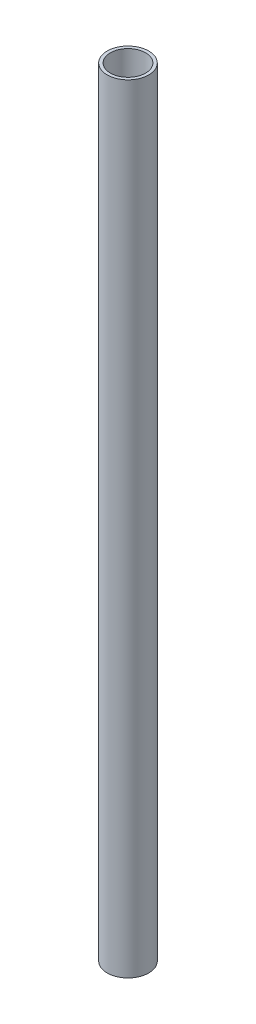
ISO-10303-21;
HEADER;
FILE_DESCRIPTION(('STEP AP214'),'2;1');
FILE_NAME('part.step','',(''),(''),'','','');
FILE_SCHEMA(('AUTOMOTIVE_DESIGN { 1 0 10303 214 1 1 1 1 }'));
ENDSEC;
DATA;
#1=APPLICATION_CONTEXT('core data for automotive mechanical design processes');
#2=APPLICATION_PROTOCOL_DEFINITION('international standard','automotive_design',2000,#1);
#3=PRODUCT_CONTEXT('',#1,'mechanical');
#4=PRODUCT('Part','Part','',(#3));
#5=PRODUCT_RELATED_PRODUCT_CATEGORY('part','',(#4));
#6=PRODUCT_DEFINITION_FORMATION('','',#4);
#7=PRODUCT_DEFINITION_CONTEXT('part definition',#1,'design');
#8=PRODUCT_DEFINITION('design','',#6,#7);
#9=PRODUCT_DEFINITION_SHAPE('','',#8);
#10=(LENGTH_UNIT() NAMED_UNIT(*) SI_UNIT(.MILLI.,.METRE.));
#11=(NAMED_UNIT(*) PLANE_ANGLE_UNIT() SI_UNIT($,.RADIAN.));
#12=(NAMED_UNIT(*) SI_UNIT($,.STERADIAN.) SOLID_ANGLE_UNIT());
#13=UNCERTAINTY_MEASURE_WITH_UNIT(LENGTH_MEASURE(1.E-05),#10,'distance_accuracy_value','');
#14=(GEOMETRIC_REPRESENTATION_CONTEXT(3) GLOBAL_UNCERTAINTY_ASSIGNED_CONTEXT((#13)) GLOBAL_UNIT_ASSIGNED_CONTEXT((#10,
#11,#12)) REPRESENTATION_CONTEXT('',''));
#15=CARTESIAN_POINT('',(0.,0.,0.));
#16=DIRECTION('',(0.,0.,1.));
#17=DIRECTION('',(1.,0.,0.));
#18=AXIS2_PLACEMENT_3D('',#15,#16,#17);
#19=CARTESIAN_POINT('',(0.,600.,0.));
#20=DIRECTION('',(0.,1.,0.));
#21=DIRECTION('',(0.,0.,1.));
#22=AXIS2_PLACEMENT_3D('',#19,#20,#21);
#23=PLANE('',#22);
#24=CARTESIAN_POINT('',(0.,600.,0.));
#25=DIRECTION('',(0.,1.,0.));
#26=DIRECTION('',(0.,0.,1.));
#27=AXIS2_PLACEMENT_3D('',#24,#25,#26);
#28=CIRCLE('',#27,16.);
#29=CARTESIAN_POINT('',(0.,600.,16.));
#30=VERTEX_POINT('',#29);
#31=EDGE_CURVE('E10',#30,#30,#28,.T.);
#32=ORIENTED_EDGE('',*,*,#31,.T.);
#33=EDGE_LOOP('',(#32));
#34=FACE_BOUND('',#33,.T.);
#35=CARTESIAN_POINT('',(0.,600.,0.));
#36=DIRECTION('',(0.,1.,0.));
#37=DIRECTION('',(0.,0.,1.));
#38=AXIS2_PLACEMENT_3D('',#35,#36,#37);
#39=CIRCLE('',#38,13.6);
#40=CARTESIAN_POINT('',(0.,600.,13.6));
#41=VERTEX_POINT('',#40);
#42=EDGE_CURVE('E50',#41,#41,#39,.T.);
#43=ORIENTED_EDGE('',*,*,#42,.F.);
#44=EDGE_LOOP('',(#43));
#45=FACE_BOUND('',#44,.T.);
#46=ADVANCED_FACE('F39',(#34,#45),#23,.T.);
#47=CARTESIAN_POINT('',(0.,0.,0.));
#48=DIRECTION('',(0.,1.,0.));
#49=DIRECTION('',(0.,0.,1.));
#50=AXIS2_PLACEMENT_3D('',#47,#48,#49);
#51=PLANE('',#50);
#52=CARTESIAN_POINT('',(0.,0.,0.));
#53=DIRECTION('',(0.,1.,0.));
#54=DIRECTION('',(0.,0.,1.));
#55=AXIS2_PLACEMENT_3D('',#52,#53,#54);
#56=CIRCLE('',#55,16.);
#57=CARTESIAN_POINT('',(0.,0.,16.));
#58=VERTEX_POINT('',#57);
#59=EDGE_CURVE('E43',#58,#58,#56,.T.);
#60=ORIENTED_EDGE('',*,*,#59,.F.);
#61=EDGE_LOOP('',(#60));
#62=FACE_BOUND('',#61,.T.);
#63=CARTESIAN_POINT('',(0.,0.,0.));
#64=DIRECTION('',(0.,1.,0.));
#65=DIRECTION('',(0.,0.,1.));
#66=AXIS2_PLACEMENT_3D('',#63,#64,#65);
#67=CIRCLE('',#66,13.6);
#68=CARTESIAN_POINT('',(0.,0.,13.6));
#69=VERTEX_POINT('',#68);
#70=EDGE_CURVE('E52',#69,#69,#67,.T.);
#71=ORIENTED_EDGE('',*,*,#70,.T.);
#72=EDGE_LOOP('',(#71));
#73=FACE_BOUND('',#72,.T.);
#74=ADVANCED_FACE('F62',(#62,#73),#51,.F.);
#75=CARTESIAN_POINT('',(0.,600.,0.));
#76=DIRECTION('',(0.,-1.,0.));
#77=DIRECTION('',(0.,0.,-1.));
#78=AXIS2_PLACEMENT_3D('',#75,#76,#77);
#79=CYLINDRICAL_SURFACE('',#78,16.);
#80=ORIENTED_EDGE('',*,*,#31,.F.);
#81=EDGE_LOOP('',(#80));
#82=FACE_BOUND('',#81,.T.);
#83=ORIENTED_EDGE('',*,*,#59,.T.);
#84=EDGE_LOOP('',(#83));
#85=FACE_BOUND('',#84,.T.);
#86=ADVANCED_FACE('F41',(#82,#85),#79,.T.);
#87=CARTESIAN_POINT('',(0.,600.,0.));
#88=DIRECTION('',(0.,-1.,0.));
#89=DIRECTION('',(0.,0.,-1.));
#90=AXIS2_PLACEMENT_3D('',#87,#88,#89);
#91=CYLINDRICAL_SURFACE('',#90,13.6);
#92=ORIENTED_EDGE('',*,*,#42,.T.);
#93=EDGE_LOOP('',(#92));
#94=FACE_BOUND('',#93,.T.);
#95=ORIENTED_EDGE('',*,*,#70,.F.);
#96=EDGE_LOOP('',(#95));
#97=FACE_BOUND('',#96,.T.);
#98=ADVANCED_FACE('F58',(#94,#97),#91,.F.);
#99=CLOSED_SHELL('',(#46,#74,#86,#98));
#100=MANIFOLD_SOLID_BREP('B2',#99);
#101=ADVANCED_BREP_SHAPE_REPRESENTATION('',(#18,#100),#14);
#102=SHAPE_DEFINITION_REPRESENTATION(#9,#101);
ENDSEC;
END-ISO-10303-21;
